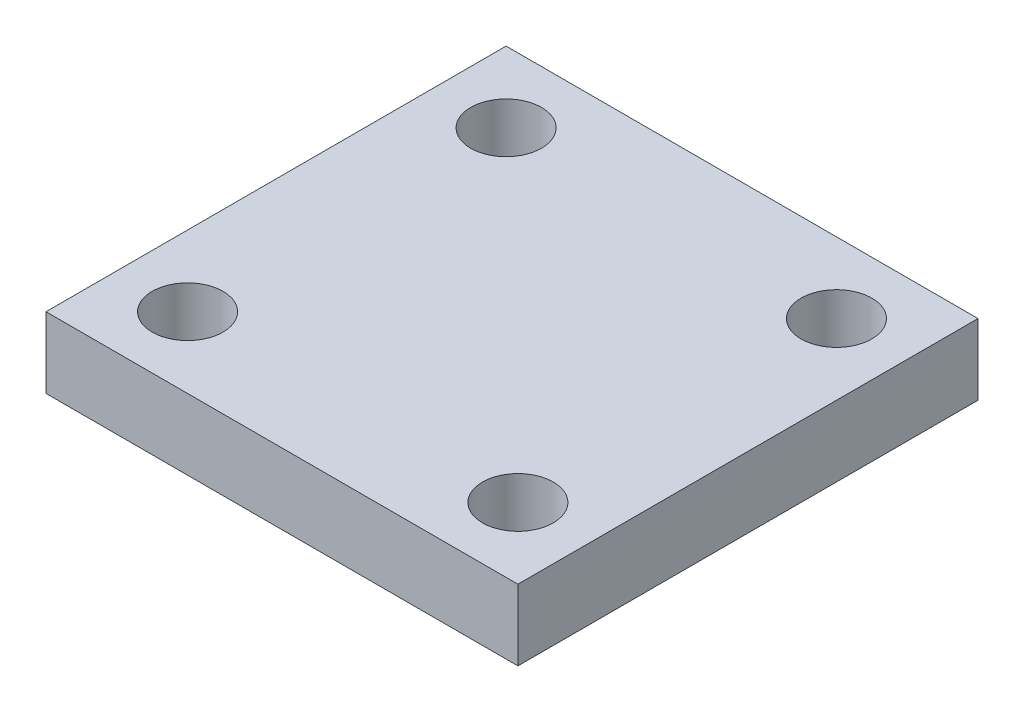
ISO-10303-21;
HEADER;
FILE_DESCRIPTION(('STEP AP214'),'2;1');
FILE_NAME('part.step','',(''),(''),'','','');
FILE_SCHEMA(('AUTOMOTIVE_DESIGN { 1 0 10303 214 1 1 1 1 }'));
ENDSEC;
DATA;
#1=APPLICATION_CONTEXT('core data for automotive mechanical design processes');
#2=APPLICATION_PROTOCOL_DEFINITION('international standard','automotive_design',2000,#1);
#3=PRODUCT_CONTEXT('',#1,'mechanical');
#4=PRODUCT('Part','Part','',(#3));
#5=PRODUCT_RELATED_PRODUCT_CATEGORY('part','',(#4));
#6=PRODUCT_DEFINITION_FORMATION('','',#4);
#7=PRODUCT_DEFINITION_CONTEXT('part definition',#1,'design');
#8=PRODUCT_DEFINITION('design','',#6,#7);
#9=PRODUCT_DEFINITION_SHAPE('','',#8);
#10=(LENGTH_UNIT() NAMED_UNIT(*) SI_UNIT(.MILLI.,.METRE.));
#11=(NAMED_UNIT(*) PLANE_ANGLE_UNIT() SI_UNIT($,.RADIAN.));
#12=(NAMED_UNIT(*) SI_UNIT($,.STERADIAN.) SOLID_ANGLE_UNIT());
#13=UNCERTAINTY_MEASURE_WITH_UNIT(LENGTH_MEASURE(1.E-05),#10,'distance_accuracy_value','');
#14=(GEOMETRIC_REPRESENTATION_CONTEXT(3) GLOBAL_UNCERTAINTY_ASSIGNED_CONTEXT((#13)) GLOBAL_UNIT_ASSIGNED_CONTEXT((#10,
#11,#12)) REPRESENTATION_CONTEXT('',''));
#15=CARTESIAN_POINT('',(0.,0.,0.));
#16=DIRECTION('',(0.,0.,1.));
#17=DIRECTION('',(1.,0.,0.));
#18=AXIS2_PLACEMENT_3D('',#15,#16,#17);
#19=CARTESIAN_POINT('',(0.,3.,0.));
#20=DIRECTION('',(0.,-1.,0.));
#21=DIRECTION('',(0.,0.,-1.));
#22=AXIS2_PLACEMENT_3D('',#19,#20,#21);
#23=PLANE('',#22);
#24=DIRECTION('',(0.,0.,1.));
#25=VECTOR('',#24,1.);
#26=CARTESIAN_POINT('',(0.,3.,0.));
#27=LINE('',#26,#25);
#28=CARTESIAN_POINT('',(0.,3.,-19.5));
#29=VERTEX_POINT('',#28);
#30=CARTESIAN_POINT('',(0.,3.,0.));
#31=VERTEX_POINT('',#30);
#32=EDGE_CURVE('E87',#29,#31,#27,.T.);
#33=ORIENTED_EDGE('',*,*,#32,.T.);
#34=DIRECTION('',(1.,0.,0.));
#35=VECTOR('',#34,1.);
#36=CARTESIAN_POINT('',(0.,3.,0.));
#37=LINE('',#36,#35);
#38=CARTESIAN_POINT('',(20.,3.,0.));
#39=VERTEX_POINT('',#38);
#40=EDGE_CURVE('E82',#31,#39,#37,.T.);
#41=ORIENTED_EDGE('',*,*,#40,.T.);
#42=DIRECTION('',(0.,0.,-1.));
#43=VECTOR('',#42,1.);
#44=CARTESIAN_POINT('',(20.,3.,0.));
#45=LINE('',#44,#43);
#46=CARTESIAN_POINT('',(20.,3.,-19.5));
#47=VERTEX_POINT('',#46);
#48=EDGE_CURVE('E85',#39,#47,#45,.T.);
#49=ORIENTED_EDGE('',*,*,#48,.T.);
#50=DIRECTION('',(-1.,0.,0.));
#51=VECTOR('',#50,1.);
#52=CARTESIAN_POINT('',(0.,3.,-19.5));
#53=LINE('',#52,#51);
#54=EDGE_CURVE('E52',#47,#29,#53,.T.);
#55=ORIENTED_EDGE('',*,*,#54,.T.);
#56=EDGE_LOOP('',(#33,#41,#49,#55));
#57=FACE_BOUND('',#56,.T.);
#58=CARTESIAN_POINT('',(3.,3.,-3.));
#59=DIRECTION('',(0.,1.,0.));
#60=DIRECTION('',(0.,0.,1.));
#61=AXIS2_PLACEMENT_3D('',#58,#59,#60);
#62=CIRCLE('',#61,1.5);
#63=CARTESIAN_POINT('',(3.,3.,-1.5));
#64=VERTEX_POINT('',#63);
#65=EDGE_CURVE('E102',#64,#64,#62,.T.);
#66=ORIENTED_EDGE('',*,*,#65,.F.);
#67=EDGE_LOOP('',(#66));
#68=FACE_BOUND('',#67,.T.);
#69=CARTESIAN_POINT('',(17.,3.,-3.));
#70=DIRECTION('',(0.,1.,0.));
#71=DIRECTION('',(0.,0.,1.));
#72=AXIS2_PLACEMENT_3D('',#69,#70,#71);
#73=CIRCLE('',#72,1.5);
#74=CARTESIAN_POINT('',(17.,3.,-1.5));
#75=VERTEX_POINT('',#74);
#76=EDGE_CURVE('E117',#75,#75,#73,.T.);
#77=ORIENTED_EDGE('',*,*,#76,.F.);
#78=EDGE_LOOP('',(#77));
#79=FACE_BOUND('',#78,.T.);
#80=CARTESIAN_POINT('',(17.,3.,-16.5));
#81=DIRECTION('',(0.,1.,0.));
#82=DIRECTION('',(0.,0.,1.));
#83=AXIS2_PLACEMENT_3D('',#80,#81,#82);
#84=CIRCLE('',#83,1.5);
#85=CARTESIAN_POINT('',(17.,3.,-15.));
#86=VERTEX_POINT('',#85);
#87=EDGE_CURVE('E123',#86,#86,#84,.T.);
#88=ORIENTED_EDGE('',*,*,#87,.F.);
#89=EDGE_LOOP('',(#88));
#90=FACE_BOUND('',#89,.T.);
#91=CARTESIAN_POINT('',(2.99999999999995,3.,-16.5));
#92=DIRECTION('',(0.,1.,0.));
#93=DIRECTION('',(0.,0.,1.));
#94=AXIS2_PLACEMENT_3D('',#91,#92,#93);
#95=CIRCLE('',#94,1.5);
#96=CARTESIAN_POINT('',(2.99999999999995,3.,-15.));
#97=VERTEX_POINT('',#96);
#98=EDGE_CURVE('E129',#97,#97,#95,.T.);
#99=ORIENTED_EDGE('',*,*,#98,.F.);
#100=EDGE_LOOP('',(#99));
#101=FACE_BOUND('',#100,.T.);
#102=ADVANCED_FACE('F35',(#57,#68,#79,#90,#101),#23,.F.);
#103=CARTESIAN_POINT('',(0.,0.,0.));
#104=DIRECTION('',(0.,-1.,0.));
#105=DIRECTION('',(0.,0.,-1.));
#106=AXIS2_PLACEMENT_3D('',#103,#104,#105);
#107=PLANE('',#106);
#108=CARTESIAN_POINT('',(17.,0.,-16.5));
#109=DIRECTION('',(0.,1.,0.));
#110=DIRECTION('',(0.,0.,1.));
#111=AXIS2_PLACEMENT_3D('',#108,#109,#110);
#112=CIRCLE('',#111,1.5);
#113=CARTESIAN_POINT('',(17.,0.,-15.));
#114=VERTEX_POINT('',#113);
#115=EDGE_CURVE('E126',#114,#114,#112,.T.);
#116=ORIENTED_EDGE('',*,*,#115,.T.);
#117=EDGE_LOOP('',(#116));
#118=FACE_BOUND('',#117,.T.);
#119=CARTESIAN_POINT('',(3.,0.,-3.));
#120=DIRECTION('',(0.,1.,0.));
#121=DIRECTION('',(0.,0.,1.));
#122=AXIS2_PLACEMENT_3D('',#119,#120,#121);
#123=CIRCLE('',#122,1.5);
#124=CARTESIAN_POINT('',(3.,0.,-1.5));
#125=VERTEX_POINT('',#124);
#126=EDGE_CURVE('E114',#125,#125,#123,.T.);
#127=ORIENTED_EDGE('',*,*,#126,.T.);
#128=EDGE_LOOP('',(#127));
#129=FACE_BOUND('',#128,.T.);
#130=DIRECTION('',(0.,0.,1.));
#131=VECTOR('',#130,1.);
#132=CARTESIAN_POINT('',(0.,0.,0.));
#133=LINE('',#132,#131);
#134=CARTESIAN_POINT('',(0.,0.,-19.5));
#135=VERTEX_POINT('',#134);
#136=CARTESIAN_POINT('',(0.,0.,0.));
#137=VERTEX_POINT('',#136);
#138=EDGE_CURVE('E99',#135,#137,#133,.T.);
#139=ORIENTED_EDGE('',*,*,#138,.F.);
#140=DIRECTION('',(-1.,0.,0.));
#141=VECTOR('',#140,1.);
#142=CARTESIAN_POINT('',(0.,0.,-19.5));
#143=LINE('',#142,#141);
#144=CARTESIAN_POINT('',(20.,0.,-19.5));
#145=VERTEX_POINT('',#144);
#146=EDGE_CURVE('E75',#145,#135,#143,.T.);
#147=ORIENTED_EDGE('',*,*,#146,.F.);
#148=DIRECTION('',(0.,0.,-1.));
#149=VECTOR('',#148,1.);
#150=CARTESIAN_POINT('',(20.,0.,0.));
#151=LINE('',#150,#149);
#152=CARTESIAN_POINT('',(20.,0.,0.));
#153=VERTEX_POINT('',#152);
#154=EDGE_CURVE('E69',#153,#145,#151,.T.);
#155=ORIENTED_EDGE('',*,*,#154,.F.);
#156=DIRECTION('',(1.,0.,0.));
#157=VECTOR('',#156,1.);
#158=CARTESIAN_POINT('',(0.,0.,0.));
#159=LINE('',#158,#157);
#160=EDGE_CURVE('E91',#137,#153,#159,.T.);
#161=ORIENTED_EDGE('',*,*,#160,.F.);
#162=EDGE_LOOP('',(#139,#147,#155,#161));
#163=FACE_BOUND('',#162,.T.);
#164=CARTESIAN_POINT('',(17.,0.,-3.));
#165=DIRECTION('',(0.,1.,0.));
#166=DIRECTION('',(0.,0.,1.));
#167=AXIS2_PLACEMENT_3D('',#164,#165,#166);
#168=CIRCLE('',#167,1.5);
#169=CARTESIAN_POINT('',(17.,0.,-1.5));
#170=VERTEX_POINT('',#169);
#171=EDGE_CURVE('E120',#170,#170,#168,.T.);
#172=ORIENTED_EDGE('',*,*,#171,.T.);
#173=EDGE_LOOP('',(#172));
#174=FACE_BOUND('',#173,.T.);
#175=CARTESIAN_POINT('',(2.99999999999995,0.,-16.5));
#176=DIRECTION('',(0.,1.,0.));
#177=DIRECTION('',(0.,0.,1.));
#178=AXIS2_PLACEMENT_3D('',#175,#176,#177);
#179=CIRCLE('',#178,1.5);
#180=CARTESIAN_POINT('',(2.99999999999995,0.,-15.));
#181=VERTEX_POINT('',#180);
#182=EDGE_CURVE('E132',#181,#181,#179,.T.);
#183=ORIENTED_EDGE('',*,*,#182,.T.);
#184=EDGE_LOOP('',(#183));
#185=FACE_BOUND('',#184,.T.);
#186=ADVANCED_FACE('F110',(#118,#129,#163,#174,#185),#107,.T.);
#187=CARTESIAN_POINT('',(0.,3.,0.));
#188=DIRECTION('',(1.,0.,0.));
#189=DIRECTION('',(0.,0.,-1.));
#190=AXIS2_PLACEMENT_3D('',#187,#188,#189);
#191=PLANE('',#190);
#192=ORIENTED_EDGE('',*,*,#138,.T.);
#193=DIRECTION('',(0.,-1.,0.));
#194=VECTOR('',#193,1.);
#195=CARTESIAN_POINT('',(0.,3.,0.));
#196=LINE('',#195,#194);
#197=EDGE_CURVE('E11',#31,#137,#196,.T.);
#198=ORIENTED_EDGE('',*,*,#197,.F.);
#199=ORIENTED_EDGE('',*,*,#32,.F.);
#200=DIRECTION('',(0.,-1.,0.));
#201=VECTOR('',#200,1.);
#202=CARTESIAN_POINT('',(0.,3.,-19.5));
#203=LINE('',#202,#201);
#204=EDGE_CURVE('E95',#29,#135,#203,.T.);
#205=ORIENTED_EDGE('',*,*,#204,.T.);
#206=EDGE_LOOP('',(#192,#198,#199,#205));
#207=FACE_BOUND('',#206,.T.);
#208=ADVANCED_FACE('F37',(#207),#191,.F.);
#209=CARTESIAN_POINT('',(0.,3.,0.));
#210=DIRECTION('',(0.,0.,-1.));
#211=DIRECTION('',(-1.,0.,0.));
#212=AXIS2_PLACEMENT_3D('',#209,#210,#211);
#213=PLANE('',#212);
#214=ORIENTED_EDGE('',*,*,#160,.T.);
#215=DIRECTION('',(0.,-1.,0.));
#216=VECTOR('',#215,1.);
#217=CARTESIAN_POINT('',(20.,3.,0.));
#218=LINE('',#217,#216);
#219=EDGE_CURVE('E44',#39,#153,#218,.T.);
#220=ORIENTED_EDGE('',*,*,#219,.F.);
#221=ORIENTED_EDGE('',*,*,#40,.F.);
#222=ORIENTED_EDGE('',*,*,#197,.T.);
#223=EDGE_LOOP('',(#214,#220,#221,#222));
#224=FACE_BOUND('',#223,.T.);
#225=ADVANCED_FACE('F90',(#224),#213,.F.);
#226=CARTESIAN_POINT('',(20.,3.,0.));
#227=DIRECTION('',(-1.,0.,0.));
#228=DIRECTION('',(0.,0.,1.));
#229=AXIS2_PLACEMENT_3D('',#226,#227,#228);
#230=PLANE('',#229);
#231=ORIENTED_EDGE('',*,*,#154,.T.);
#232=DIRECTION('',(0.,-1.,0.));
#233=VECTOR('',#232,1.);
#234=CARTESIAN_POINT('',(20.,3.,-19.5));
#235=LINE('',#234,#233);
#236=EDGE_CURVE('E92',#47,#145,#235,.T.);
#237=ORIENTED_EDGE('',*,*,#236,.F.);
#238=ORIENTED_EDGE('',*,*,#48,.F.);
#239=ORIENTED_EDGE('',*,*,#219,.T.);
#240=EDGE_LOOP('',(#231,#237,#238,#239));
#241=FACE_BOUND('',#240,.T.);
#242=ADVANCED_FACE('F93',(#241),#230,.F.);
#243=CARTESIAN_POINT('',(0.,3.,-19.5));
#244=DIRECTION('',(0.,0.,1.));
#245=DIRECTION('',(1.,0.,0.));
#246=AXIS2_PLACEMENT_3D('',#243,#244,#245);
#247=PLANE('',#246);
#248=ORIENTED_EDGE('',*,*,#146,.T.);
#249=ORIENTED_EDGE('',*,*,#204,.F.);
#250=ORIENTED_EDGE('',*,*,#54,.F.);
#251=ORIENTED_EDGE('',*,*,#236,.T.);
#252=EDGE_LOOP('',(#248,#249,#250,#251));
#253=FACE_BOUND('',#252,.T.);
#254=ADVANCED_FACE('F107',(#253),#247,.F.);
#255=CARTESIAN_POINT('',(3.,3.,-3.));
#256=DIRECTION('',(0.,-1.,0.));
#257=DIRECTION('',(0.,0.,-1.));
#258=AXIS2_PLACEMENT_3D('',#255,#256,#257);
#259=CYLINDRICAL_SURFACE('',#258,1.5);
#260=ORIENTED_EDGE('',*,*,#65,.T.);
#261=EDGE_LOOP('',(#260));
#262=FACE_BOUND('',#261,.T.);
#263=ORIENTED_EDGE('',*,*,#126,.F.);
#264=EDGE_LOOP('',(#263));
#265=FACE_BOUND('',#264,.T.);
#266=ADVANCED_FACE('F149',(#262,#265),#259,.F.);
#267=CARTESIAN_POINT('',(17.,3.,-3.));
#268=DIRECTION('',(0.,-1.,0.));
#269=DIRECTION('',(0.,0.,-1.));
#270=AXIS2_PLACEMENT_3D('',#267,#268,#269);
#271=CYLINDRICAL_SURFACE('',#270,1.5);
#272=ORIENTED_EDGE('',*,*,#76,.T.);
#273=EDGE_LOOP('',(#272));
#274=FACE_BOUND('',#273,.T.);
#275=ORIENTED_EDGE('',*,*,#171,.F.);
#276=EDGE_LOOP('',(#275));
#277=FACE_BOUND('',#276,.T.);
#278=ADVANCED_FACE('F195',(#274,#277),#271,.F.);
#279=CARTESIAN_POINT('',(17.,3.,-16.5));
#280=DIRECTION('',(0.,-1.,0.));
#281=DIRECTION('',(0.,0.,-1.));
#282=AXIS2_PLACEMENT_3D('',#279,#280,#281);
#283=CYLINDRICAL_SURFACE('',#282,1.5);
#284=ORIENTED_EDGE('',*,*,#87,.T.);
#285=EDGE_LOOP('',(#284));
#286=FACE_BOUND('',#285,.T.);
#287=ORIENTED_EDGE('',*,*,#115,.F.);
#288=EDGE_LOOP('',(#287));
#289=FACE_BOUND('',#288,.T.);
#290=ADVANCED_FACE('F203',(#286,#289),#283,.F.);
#291=CARTESIAN_POINT('',(2.99999999999995,3.,-16.5));
#292=DIRECTION('',(0.,-1.,0.));
#293=DIRECTION('',(0.,0.,-1.));
#294=AXIS2_PLACEMENT_3D('',#291,#292,#293);
#295=CYLINDRICAL_SURFACE('',#294,1.5);
#296=ORIENTED_EDGE('',*,*,#98,.T.);
#297=EDGE_LOOP('',(#296));
#298=FACE_BOUND('',#297,.T.);
#299=ORIENTED_EDGE('',*,*,#182,.F.);
#300=EDGE_LOOP('',(#299));
#301=FACE_BOUND('',#300,.T.);
#302=ADVANCED_FACE('F138',(#298,#301),#295,.F.);
#303=CLOSED_SHELL('',(#102,#186,#208,#225,#242,#254,#266,#278,#290,#302));
#304=MANIFOLD_SOLID_BREP('B2',#303);
#305=ADVANCED_BREP_SHAPE_REPRESENTATION('',(#18,#304),#14);
#306=SHAPE_DEFINITION_REPRESENTATION(#9,#305);
ENDSEC;
END-ISO-10303-21;
